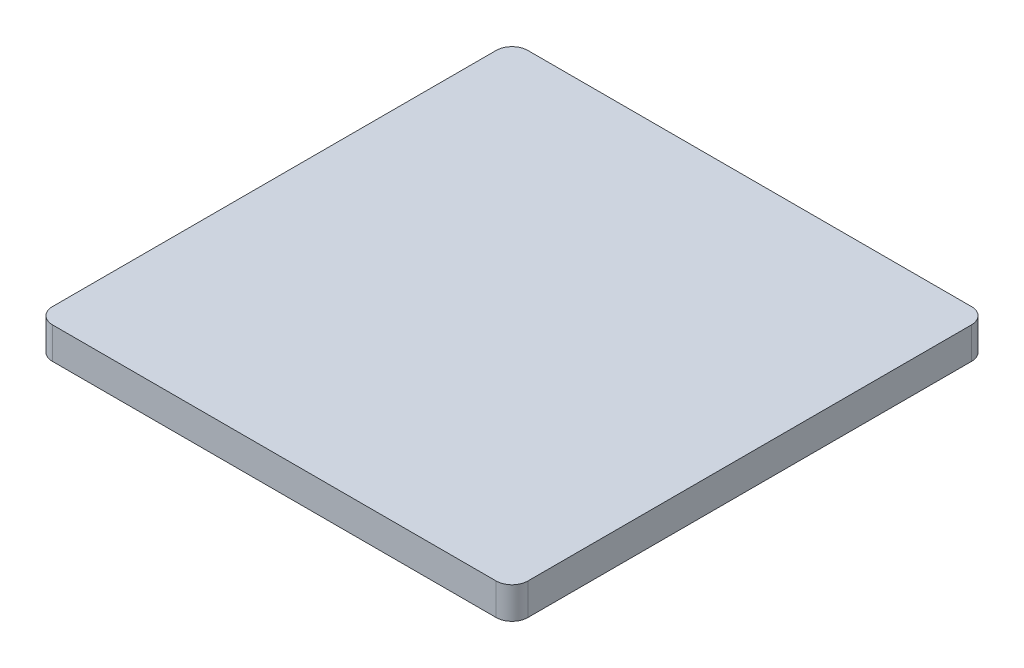
ISO-10303-21;
HEADER;
FILE_DESCRIPTION(('STEP AP214'),'2;1');
FILE_NAME('part.step','',(''),(''),'','','');
FILE_SCHEMA(('AUTOMOTIVE_DESIGN { 1 0 10303 214 1 1 1 1 }'));
ENDSEC;
DATA;
#1=APPLICATION_CONTEXT('core data for automotive mechanical design processes');
#2=APPLICATION_PROTOCOL_DEFINITION('international standard','automotive_design',2000,#1);
#3=PRODUCT_CONTEXT('',#1,'mechanical');
#4=PRODUCT('Part','Part','',(#3));
#5=PRODUCT_RELATED_PRODUCT_CATEGORY('part','',(#4));
#6=PRODUCT_DEFINITION_FORMATION('','',#4);
#7=PRODUCT_DEFINITION_CONTEXT('part definition',#1,'design');
#8=PRODUCT_DEFINITION('design','',#6,#7);
#9=PRODUCT_DEFINITION_SHAPE('','',#8);
#10=(LENGTH_UNIT() NAMED_UNIT(*) SI_UNIT(.MILLI.,.METRE.));
#11=(NAMED_UNIT(*) PLANE_ANGLE_UNIT() SI_UNIT($,.RADIAN.));
#12=(NAMED_UNIT(*) SI_UNIT($,.STERADIAN.) SOLID_ANGLE_UNIT());
#13=UNCERTAINTY_MEASURE_WITH_UNIT(LENGTH_MEASURE(1.E-05),#10,'distance_accuracy_value','');
#14=(GEOMETRIC_REPRESENTATION_CONTEXT(3) GLOBAL_UNCERTAINTY_ASSIGNED_CONTEXT((#13)) GLOBAL_UNIT_ASSIGNED_CONTEXT((#10,
#11,#12)) REPRESENTATION_CONTEXT('',''));
#15=CARTESIAN_POINT('',(0.,0.,0.));
#16=DIRECTION('',(0.,0.,1.));
#17=DIRECTION('',(1.,0.,0.));
#18=AXIS2_PLACEMENT_3D('',#15,#16,#17);
#19=CARTESIAN_POINT('',(-15.,2.,15.));
#20=DIRECTION('',(1.,0.,0.));
#21=DIRECTION('',(0.,0.,-1.));
#22=AXIS2_PLACEMENT_3D('',#19,#20,#21);
#23=PLANE('',#22);
#24=DIRECTION('',(0.,0.,1.));
#25=VECTOR('',#24,1.);
#26=CARTESIAN_POINT('',(-15.,2.,15.));
#27=LINE('',#26,#25);
#28=CARTESIAN_POINT('',(-15.,2.,-14.));
#29=VERTEX_POINT('',#28);
#30=CARTESIAN_POINT('',(-15.,2.,14.));
#31=VERTEX_POINT('',#30);
#32=EDGE_CURVE('E120',#29,#31,#27,.T.);
#33=ORIENTED_EDGE('',*,*,#32,.F.);
#34=DIRECTION('',(0.,-1.,0.));
#35=VECTOR('',#34,1.);
#36=CARTESIAN_POINT('',(-15.,2.,-14.));
#37=LINE('',#36,#35);
#38=CARTESIAN_POINT('',(-15.,0.,-14.));
#39=VERTEX_POINT('',#38);
#40=EDGE_CURVE('E105',#29,#39,#37,.T.);
#41=ORIENTED_EDGE('',*,*,#40,.T.);
#42=DIRECTION('',(0.,0.,1.));
#43=VECTOR('',#42,1.);
#44=CARTESIAN_POINT('',(-15.,0.,15.));
#45=LINE('',#44,#43);
#46=CARTESIAN_POINT('',(-15.,0.,14.));
#47=VERTEX_POINT('',#46);
#48=EDGE_CURVE('E117',#39,#47,#45,.T.);
#49=ORIENTED_EDGE('',*,*,#48,.T.);
#50=DIRECTION('',(0.,-1.,0.));
#51=VECTOR('',#50,1.);
#52=CARTESIAN_POINT('',(-15.,2.,14.));
#53=LINE('',#52,#51);
#54=EDGE_CURVE('E122',#47,#31,#53,.F.);
#55=ORIENTED_EDGE('',*,*,#54,.T.);
#56=EDGE_LOOP('',(#33,#41,#49,#55));
#57=FACE_BOUND('',#56,.T.);
#58=ADVANCED_FACE('F35',(#57),#23,.F.);
#59=CARTESIAN_POINT('',(15.,2.,15.));
#60=DIRECTION('',(0.,0.,-1.));
#61=DIRECTION('',(-1.,0.,0.));
#62=AXIS2_PLACEMENT_3D('',#59,#60,#61);
#63=PLANE('',#62);
#64=DIRECTION('',(1.,0.,0.));
#65=VECTOR('',#64,1.);
#66=CARTESIAN_POINT('',(15.,0.,15.));
#67=LINE('',#66,#65);
#68=CARTESIAN_POINT('',(-14.,0.,15.));
#69=VERTEX_POINT('',#68);
#70=CARTESIAN_POINT('',(14.,0.,15.));
#71=VERTEX_POINT('',#70);
#72=EDGE_CURVE('E126',#69,#71,#67,.T.);
#73=ORIENTED_EDGE('',*,*,#72,.T.);
#74=DIRECTION('',(0.,-1.,0.));
#75=VECTOR('',#74,1.);
#76=CARTESIAN_POINT('',(14.,2.,15.));
#77=LINE('',#76,#75);
#78=CARTESIAN_POINT('',(14.,2.,15.));
#79=VERTEX_POINT('',#78);
#80=EDGE_CURVE('E11',#71,#79,#77,.F.);
#81=ORIENTED_EDGE('',*,*,#80,.T.);
#82=DIRECTION('',(1.,0.,0.));
#83=VECTOR('',#82,1.);
#84=CARTESIAN_POINT('',(15.,2.,15.));
#85=LINE('',#84,#83);
#86=CARTESIAN_POINT('',(-14.,2.,15.));
#87=VERTEX_POINT('',#86);
#88=EDGE_CURVE('E162',#87,#79,#85,.T.);
#89=ORIENTED_EDGE('',*,*,#88,.F.);
#90=DIRECTION('',(0.,-1.,0.));
#91=VECTOR('',#90,1.);
#92=CARTESIAN_POINT('',(-14.,2.,15.));
#93=LINE('',#92,#91);
#94=EDGE_CURVE('E43',#87,#69,#93,.T.);
#95=ORIENTED_EDGE('',*,*,#94,.T.);
#96=EDGE_LOOP('',(#73,#81,#89,#95));
#97=FACE_BOUND('',#96,.T.);
#98=ADVANCED_FACE('F160',(#97),#63,.F.);
#99=CARTESIAN_POINT('',(15.,2.,15.));
#100=DIRECTION('',(-1.,0.,0.));
#101=DIRECTION('',(0.,0.,1.));
#102=AXIS2_PLACEMENT_3D('',#99,#100,#101);
#103=PLANE('',#102);
#104=DIRECTION('',(0.,0.,-1.));
#105=VECTOR('',#104,1.);
#106=CARTESIAN_POINT('',(15.,0.,15.));
#107=LINE('',#106,#105);
#108=CARTESIAN_POINT('',(15.,0.,14.));
#109=VERTEX_POINT('',#108);
#110=CARTESIAN_POINT('',(15.,0.,-14.));
#111=VERTEX_POINT('',#110);
#112=EDGE_CURVE('E129',#109,#111,#107,.T.);
#113=ORIENTED_EDGE('',*,*,#112,.T.);
#114=DIRECTION('',(0.,-1.,0.));
#115=VECTOR('',#114,1.);
#116=CARTESIAN_POINT('',(15.,2.,-14.));
#117=LINE('',#116,#115);
#118=CARTESIAN_POINT('',(15.,2.,-14.));
#119=VERTEX_POINT('',#118);
#120=EDGE_CURVE('E50',#111,#119,#117,.F.);
#121=ORIENTED_EDGE('',*,*,#120,.T.);
#122=DIRECTION('',(0.,0.,-1.));
#123=VECTOR('',#122,1.);
#124=CARTESIAN_POINT('',(15.,2.,15.));
#125=LINE('',#124,#123);
#126=CARTESIAN_POINT('',(15.,2.,14.));
#127=VERTEX_POINT('',#126);
#128=EDGE_CURVE('E170',#127,#119,#125,.T.);
#129=ORIENTED_EDGE('',*,*,#128,.F.);
#130=DIRECTION('',(0.,-1.,0.));
#131=VECTOR('',#130,1.);
#132=CARTESIAN_POINT('',(15.,2.,14.));
#133=LINE('',#132,#131);
#134=EDGE_CURVE('E153',#127,#109,#133,.T.);
#135=ORIENTED_EDGE('',*,*,#134,.T.);
#136=EDGE_LOOP('',(#113,#121,#129,#135));
#137=FACE_BOUND('',#136,.T.);
#138=ADVANCED_FACE('F169',(#137),#103,.F.);
#139=CARTESIAN_POINT('',(15.,2.,-15.));
#140=DIRECTION('',(0.,0.,1.));
#141=DIRECTION('',(1.,0.,0.));
#142=AXIS2_PLACEMENT_3D('',#139,#140,#141);
#143=PLANE('',#142);
#144=DIRECTION('',(-1.,0.,0.));
#145=VECTOR('',#144,1.);
#146=CARTESIAN_POINT('',(15.,0.,-15.));
#147=LINE('',#146,#145);
#148=CARTESIAN_POINT('',(14.,0.,-15.));
#149=VERTEX_POINT('',#148);
#150=CARTESIAN_POINT('',(-14.,0.,-15.));
#151=VERTEX_POINT('',#150);
#152=EDGE_CURVE('E136',#149,#151,#147,.T.);
#153=ORIENTED_EDGE('',*,*,#152,.T.);
#154=DIRECTION('',(0.,-1.,0.));
#155=VECTOR('',#154,1.);
#156=CARTESIAN_POINT('',(-14.,2.,-15.));
#157=LINE('',#156,#155);
#158=CARTESIAN_POINT('',(-14.,2.,-15.));
#159=VERTEX_POINT('',#158);
#160=EDGE_CURVE('E106',#151,#159,#157,.F.);
#161=ORIENTED_EDGE('',*,*,#160,.T.);
#162=DIRECTION('',(-1.,0.,0.));
#163=VECTOR('',#162,1.);
#164=CARTESIAN_POINT('',(15.,2.,-15.));
#165=LINE('',#164,#163);
#166=CARTESIAN_POINT('',(14.,2.,-15.));
#167=VERTEX_POINT('',#166);
#168=EDGE_CURVE('E132',#167,#159,#165,.T.);
#169=ORIENTED_EDGE('',*,*,#168,.F.);
#170=DIRECTION('',(0.,-1.,0.));
#171=VECTOR('',#170,1.);
#172=CARTESIAN_POINT('',(14.,2.,-15.));
#173=LINE('',#172,#171);
#174=EDGE_CURVE('E111',#167,#149,#173,.T.);
#175=ORIENTED_EDGE('',*,*,#174,.T.);
#176=EDGE_LOOP('',(#153,#161,#169,#175));
#177=FACE_BOUND('',#176,.T.);
#178=ADVANCED_FACE('F198',(#177),#143,.F.);
#179=CARTESIAN_POINT('',(-15.,2.,-15.));
#180=DIRECTION('',(0.,1.,0.));
#181=DIRECTION('',(0.,0.,1.));
#182=AXIS2_PLACEMENT_3D('',#179,#180,#181);
#183=PLANE('',#182);
#184=ORIENTED_EDGE('',*,*,#168,.T.);
#185=CARTESIAN_POINT('',(-14.,2.,-14.));
#186=DIRECTION('',(0.,1.,0.));
#187=DIRECTION('',(0.,0.,1.));
#188=AXIS2_PLACEMENT_3D('',#185,#186,#187);
#189=CIRCLE('',#188,1.);
#190=EDGE_CURVE('E151',#159,#29,#189,.T.);
#191=ORIENTED_EDGE('',*,*,#190,.T.);
#192=ORIENTED_EDGE('',*,*,#32,.T.);
#193=CARTESIAN_POINT('',(-14.,2.,14.));
#194=DIRECTION('',(0.,1.,0.));
#195=DIRECTION('',(0.,0.,1.));
#196=AXIS2_PLACEMENT_3D('',#193,#194,#195);
#197=CIRCLE('',#196,1.);
#198=EDGE_CURVE('E146',#31,#87,#197,.T.);
#199=ORIENTED_EDGE('',*,*,#198,.T.);
#200=ORIENTED_EDGE('',*,*,#88,.T.);
#201=CARTESIAN_POINT('',(14.,2.,14.));
#202=DIRECTION('',(0.,1.,0.));
#203=DIRECTION('',(0.,0.,1.));
#204=AXIS2_PLACEMENT_3D('',#201,#202,#203);
#205=CIRCLE('',#204,1.);
#206=EDGE_CURVE('E57',#79,#127,#205,.T.);
#207=ORIENTED_EDGE('',*,*,#206,.T.);
#208=ORIENTED_EDGE('',*,*,#128,.T.);
#209=CARTESIAN_POINT('',(14.,2.,-14.));
#210=DIRECTION('',(0.,1.,0.));
#211=DIRECTION('',(0.,0.,1.));
#212=AXIS2_PLACEMENT_3D('',#209,#210,#211);
#213=CIRCLE('',#212,1.);
#214=EDGE_CURVE('E149',#119,#167,#213,.T.);
#215=ORIENTED_EDGE('',*,*,#214,.T.);
#216=EDGE_LOOP('',(#184,#191,#192,#199,#200,#207,#208,#215));
#217=FACE_BOUND('',#216,.T.);
#218=ADVANCED_FACE('F175',(#217),#183,.T.);
#219=CARTESIAN_POINT('',(-15.,0.,-15.));
#220=DIRECTION('',(0.,1.,0.));
#221=DIRECTION('',(0.,0.,1.));
#222=AXIS2_PLACEMENT_3D('',#219,#220,#221);
#223=PLANE('',#222);
#224=ORIENTED_EDGE('',*,*,#48,.F.);
#225=CARTESIAN_POINT('',(-14.,0.,-14.));
#226=DIRECTION('',(0.,1.,0.));
#227=DIRECTION('',(0.,0.,1.));
#228=AXIS2_PLACEMENT_3D('',#225,#226,#227);
#229=CIRCLE('',#228,1.);
#230=EDGE_CURVE('E101',#39,#151,#229,.F.);
#231=ORIENTED_EDGE('',*,*,#230,.T.);
#232=ORIENTED_EDGE('',*,*,#152,.F.);
#233=CARTESIAN_POINT('',(14.,0.,-14.));
#234=DIRECTION('',(0.,1.,0.));
#235=DIRECTION('',(0.,0.,1.));
#236=AXIS2_PLACEMENT_3D('',#233,#234,#235);
#237=CIRCLE('',#236,1.);
#238=EDGE_CURVE('E112',#149,#111,#237,.F.);
#239=ORIENTED_EDGE('',*,*,#238,.T.);
#240=ORIENTED_EDGE('',*,*,#112,.F.);
#241=CARTESIAN_POINT('',(14.,0.,14.));
#242=DIRECTION('',(0.,1.,0.));
#243=DIRECTION('',(0.,0.,1.));
#244=AXIS2_PLACEMENT_3D('',#241,#242,#243);
#245=CIRCLE('',#244,1.);
#246=EDGE_CURVE('E140',#109,#71,#245,.F.);
#247=ORIENTED_EDGE('',*,*,#246,.T.);
#248=ORIENTED_EDGE('',*,*,#72,.F.);
#249=CARTESIAN_POINT('',(-14.,0.,14.));
#250=DIRECTION('',(0.,1.,0.));
#251=DIRECTION('',(0.,0.,1.));
#252=AXIS2_PLACEMENT_3D('',#249,#250,#251);
#253=CIRCLE('',#252,1.);
#254=EDGE_CURVE('E121',#69,#47,#253,.F.);
#255=ORIENTED_EDGE('',*,*,#254,.T.);
#256=EDGE_LOOP('',(#224,#231,#232,#239,#240,#247,#248,#255));
#257=FACE_BOUND('',#256,.T.);
#258=ADVANCED_FACE('F124',(#257),#223,.F.);
#259=CARTESIAN_POINT('',(-14.,2.,-14.));
#260=DIRECTION('',(0.,-1.,0.));
#261=DIRECTION('',(0.,0.,-1.));
#262=AXIS2_PLACEMENT_3D('',#259,#260,#261);
#263=CYLINDRICAL_SURFACE('',#262,1.);
#264=ORIENTED_EDGE('',*,*,#190,.F.);
#265=ORIENTED_EDGE('',*,*,#160,.F.);
#266=ORIENTED_EDGE('',*,*,#230,.F.);
#267=ORIENTED_EDGE('',*,*,#40,.F.);
#268=EDGE_LOOP('',(#264,#265,#266,#267));
#269=FACE_BOUND('',#268,.T.);
#270=ADVANCED_FACE('F104',(#269),#263,.T.);
#271=CARTESIAN_POINT('',(14.,2.,-14.));
#272=DIRECTION('',(0.,-1.,0.));
#273=DIRECTION('',(0.,0.,-1.));
#274=AXIS2_PLACEMENT_3D('',#271,#272,#273);
#275=CYLINDRICAL_SURFACE('',#274,1.);
#276=ORIENTED_EDGE('',*,*,#214,.F.);
#277=ORIENTED_EDGE('',*,*,#120,.F.);
#278=ORIENTED_EDGE('',*,*,#238,.F.);
#279=ORIENTED_EDGE('',*,*,#174,.F.);
#280=EDGE_LOOP('',(#276,#277,#278,#279));
#281=FACE_BOUND('',#280,.T.);
#282=ADVANCED_FACE('F180',(#281),#275,.T.);
#283=CARTESIAN_POINT('',(14.,2.,14.));
#284=DIRECTION('',(0.,-1.,0.));
#285=DIRECTION('',(0.,0.,-1.));
#286=AXIS2_PLACEMENT_3D('',#283,#284,#285);
#287=CYLINDRICAL_SURFACE('',#286,1.);
#288=ORIENTED_EDGE('',*,*,#206,.F.);
#289=ORIENTED_EDGE('',*,*,#80,.F.);
#290=ORIENTED_EDGE('',*,*,#246,.F.);
#291=ORIENTED_EDGE('',*,*,#134,.F.);
#292=EDGE_LOOP('',(#288,#289,#290,#291));
#293=FACE_BOUND('',#292,.T.);
#294=ADVANCED_FACE('F168',(#293),#287,.T.);
#295=CARTESIAN_POINT('',(-14.,2.,14.));
#296=DIRECTION('',(0.,-1.,0.));
#297=DIRECTION('',(0.,0.,-1.));
#298=AXIS2_PLACEMENT_3D('',#295,#296,#297);
#299=CYLINDRICAL_SURFACE('',#298,1.);
#300=ORIENTED_EDGE('',*,*,#198,.F.);
#301=ORIENTED_EDGE('',*,*,#54,.F.);
#302=ORIENTED_EDGE('',*,*,#254,.F.);
#303=ORIENTED_EDGE('',*,*,#94,.F.);
#304=EDGE_LOOP('',(#300,#301,#302,#303));
#305=FACE_BOUND('',#304,.T.);
#306=ADVANCED_FACE('F37',(#305),#299,.T.);
#307=CLOSED_SHELL('',(#58,#98,#138,#178,#218,#258,#270,#282,#294,#306));
#308=MANIFOLD_SOLID_BREP('B2',#307);
#309=ADVANCED_BREP_SHAPE_REPRESENTATION('',(#18,#308),#14);
#310=SHAPE_DEFINITION_REPRESENTATION(#9,#309);
ENDSEC;
END-ISO-10303-21;
